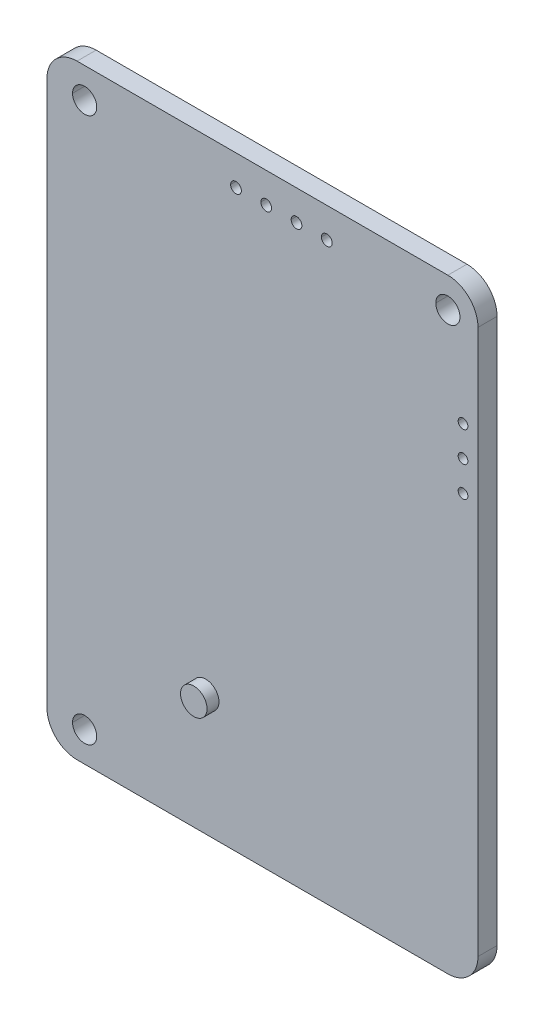
ISO-10303-21;
HEADER;
FILE_DESCRIPTION(('STEP AP214'),'2;1');
FILE_NAME('part.step','',(''),(''),'','','');
FILE_SCHEMA(('AUTOMOTIVE_DESIGN { 1 0 10303 214 1 1 1 1 }'));
ENDSEC;
DATA;
#1=APPLICATION_CONTEXT('core data for automotive mechanical design processes');
#2=APPLICATION_PROTOCOL_DEFINITION('international standard','automotive_design',2000,#1);
#3=PRODUCT_CONTEXT('',#1,'mechanical');
#4=PRODUCT('Part','Part','',(#3));
#5=PRODUCT_RELATED_PRODUCT_CATEGORY('part','',(#4));
#6=PRODUCT_DEFINITION_FORMATION('','',#4);
#7=PRODUCT_DEFINITION_CONTEXT('part definition',#1,'design');
#8=PRODUCT_DEFINITION('design','',#6,#7);
#9=PRODUCT_DEFINITION_SHAPE('','',#8);
#10=(LENGTH_UNIT() NAMED_UNIT(*) SI_UNIT(.MILLI.,.METRE.));
#11=(NAMED_UNIT(*) PLANE_ANGLE_UNIT() SI_UNIT($,.RADIAN.));
#12=(NAMED_UNIT(*) SI_UNIT($,.STERADIAN.) SOLID_ANGLE_UNIT());
#13=UNCERTAINTY_MEASURE_WITH_UNIT(LENGTH_MEASURE(1.E-05),#10,'distance_accuracy_value','');
#14=(GEOMETRIC_REPRESENTATION_CONTEXT(3) GLOBAL_UNCERTAINTY_ASSIGNED_CONTEXT((#13)) GLOBAL_UNIT_ASSIGNED_CONTEXT((#10,
#11,#12)) REPRESENTATION_CONTEXT('',''));
#15=CARTESIAN_POINT('',(0.,0.,0.));
#16=DIRECTION('',(0.,0.,1.));
#17=DIRECTION('',(1.,0.,0.));
#18=AXIS2_PLACEMENT_3D('',#15,#16,#17);
#19=CARTESIAN_POINT('',(17.46253492507,-25.4000508001,1.600028244856));
#20=DIRECTION('',(0.,0.,-1.));
#21=DIRECTION('',(0.,-1.,0.));
#22=AXIS2_PLACEMENT_3D('',#19,#20,#21);
#23=PLANE('',#22);
#24=CARTESIAN_POINT('',(12.7000254000505,-40.635081284928,1.600028244856));
#25=DIRECTION('',(0.,0.,-1.));
#26=DIRECTION('',(-1.,0.,0.));
#27=AXIS2_PLACEMENT_3D('',#24,#25,#26);
#28=CIRCLE('',#27,1.11210639390257);
#29=CARTESIAN_POINT('',(11.5879190061479,-40.635081284928,1.600028244856));
#30=VERTEX_POINT('',#29);
#31=EDGE_CURVE('E11',#30,#30,#28,.F.);
#32=ORIENTED_EDGE('',*,*,#31,.F.);
#33=EDGE_LOOP('',(#32));
#34=FACE_BOUND('',#33,.T.);
#35=CARTESIAN_POINT('',(34.290068580137,-10.16002032004,1.600028244856));
#36=DIRECTION('',(0.,0.,1.));
#37=DIRECTION('',(-1.,0.,0.));
#38=AXIS2_PLACEMENT_3D('',#35,#36,#37);
#39=CIRCLE('',#38,0.406400812802);
#40=CARTESIAN_POINT('',(33.883667767336,-10.16002032004,1.600028244856));
#41=VERTEX_POINT('',#40);
#42=CARTESIAN_POINT('',(34.696469392939,-10.16002032004,1.600028244856));
#43=VERTEX_POINT('',#42);
#44=EDGE_CURVE('E76',#41,#43,#39,.T.);
#45=ORIENTED_EDGE('',*,*,#44,.F.);
#46=CARTESIAN_POINT('',(34.290068580137,-10.16002032004,1.600028244856));
#47=DIRECTION('',(0.,0.,1.));
#48=DIRECTION('',(1.,0.,0.));
#49=AXIS2_PLACEMENT_3D('',#46,#47,#48);
#50=CIRCLE('',#49,0.406400812802);
#51=EDGE_CURVE('E443',#43,#41,#50,.T.);
#52=ORIENTED_EDGE('',*,*,#51,.F.);
#53=EDGE_LOOP('',(#45,#52));
#54=FACE_BOUND('',#53,.T.);
#55=CARTESIAN_POINT('',(34.290068580137,-12.70002540005,1.600028244856));
#56=DIRECTION('',(0.,0.,1.));
#57=DIRECTION('',(-1.,0.,0.));
#58=AXIS2_PLACEMENT_3D('',#55,#56,#57);
#59=CIRCLE('',#58,0.406400812802);
#60=CARTESIAN_POINT('',(33.883667767336,-12.70002540005,1.600028244856));
#61=VERTEX_POINT('',#60);
#62=CARTESIAN_POINT('',(34.696469392939,-12.70002540005,1.600028244856));
#63=VERTEX_POINT('',#62);
#64=EDGE_CURVE('E605',#61,#63,#59,.T.);
#65=ORIENTED_EDGE('',*,*,#64,.F.);
#66=CARTESIAN_POINT('',(34.290068580137,-12.70002540005,1.600028244856));
#67=DIRECTION('',(0.,0.,1.));
#68=DIRECTION('',(1.,0.,0.));
#69=AXIS2_PLACEMENT_3D('',#66,#67,#68);
#70=CIRCLE('',#69,0.406400812802);
#71=EDGE_CURVE('E394',#63,#61,#70,.T.);
#72=ORIENTED_EDGE('',*,*,#71,.F.);
#73=EDGE_LOOP('',(#65,#72));
#74=FACE_BOUND('',#73,.T.);
#75=CARTESIAN_POINT('',(34.290068580137,-15.24003048006,1.600028244856));
#76=DIRECTION('',(0.,0.,1.));
#77=DIRECTION('',(-1.,0.,0.));
#78=AXIS2_PLACEMENT_3D('',#75,#76,#77);
#79=CIRCLE('',#78,0.406400812802);
#80=CARTESIAN_POINT('',(33.883667767336,-15.24003048006,1.600028244856));
#81=VERTEX_POINT('',#80);
#82=CARTESIAN_POINT('',(34.696469392939,-15.24003048006,1.600028244856));
#83=VERTEX_POINT('',#82);
#84=EDGE_CURVE('E593',#81,#83,#79,.T.);
#85=ORIENTED_EDGE('',*,*,#84,.F.);
#86=CARTESIAN_POINT('',(34.290068580137,-15.24003048006,1.600028244856));
#87=DIRECTION('',(0.,0.,1.));
#88=DIRECTION('',(1.,0.,0.));
#89=AXIS2_PLACEMENT_3D('',#86,#87,#88);
#90=CIRCLE('',#89,0.406400812802);
#91=EDGE_CURVE('E476',#83,#81,#90,.T.);
#92=ORIENTED_EDGE('',*,*,#91,.F.);
#93=EDGE_LOOP('',(#85,#92));
#94=FACE_BOUND('',#93,.T.);
#95=CARTESIAN_POINT('',(33.020066040132,-2.54000508001,1.600028244856));
#96=DIRECTION('',(0.,0.,1.));
#97=DIRECTION('',(-1.,0.,0.));
#98=AXIS2_PLACEMENT_3D('',#95,#96,#97);
#99=CIRCLE('',#98,1.016002032004);
#100=CARTESIAN_POINT('',(32.004064008128,-2.54000508001,1.600028244856));
#101=VERTEX_POINT('',#100);
#102=CARTESIAN_POINT('',(34.036068072136,-2.54000508001,1.600028244856));
#103=VERTEX_POINT('',#102);
#104=EDGE_CURVE('E378',#101,#103,#99,.T.);
#105=ORIENTED_EDGE('',*,*,#104,.F.);
#106=CARTESIAN_POINT('',(33.020066040132,-2.54000508001,1.600028244856));
#107=DIRECTION('',(0.,0.,1.));
#108=DIRECTION('',(1.,0.,0.));
#109=AXIS2_PLACEMENT_3D('',#106,#107,#108);
#110=CIRCLE('',#109,1.016002032004);
#111=EDGE_CURVE('E482',#103,#101,#110,.T.);
#112=ORIENTED_EDGE('',*,*,#111,.F.);
#113=EDGE_LOOP('',(#105,#112));
#114=FACE_BOUND('',#113,.T.);
#115=CARTESIAN_POINT('',(22.860045720091,-2.54000508001,1.600028244856));
#116=DIRECTION('',(0.,0.,1.));
#117=DIRECTION('',(-1.,0.,0.));
#118=AXIS2_PLACEMENT_3D('',#115,#116,#117);
#119=CIRCLE('',#118,0.450012700025);
#120=CARTESIAN_POINT('',(22.410033020066,-2.54000508001,1.600028244856));
#121=VERTEX_POINT('',#120);
#122=CARTESIAN_POINT('',(23.310058420117,-2.54000508001,1.600028244856));
#123=VERTEX_POINT('',#122);
#124=EDGE_CURVE('E570',#121,#123,#119,.T.);
#125=ORIENTED_EDGE('',*,*,#124,.F.);
#126=CARTESIAN_POINT('',(22.860045720091,-2.54000508001,1.600028244856));
#127=DIRECTION('',(0.,0.,1.));
#128=DIRECTION('',(1.,0.,0.));
#129=AXIS2_PLACEMENT_3D('',#126,#127,#128);
#130=CIRCLE('',#129,0.450012700025);
#131=EDGE_CURVE('E558',#123,#121,#130,.T.);
#132=ORIENTED_EDGE('',*,*,#131,.F.);
#133=EDGE_LOOP('',(#125,#132));
#134=FACE_BOUND('',#133,.T.);
#135=CARTESIAN_POINT('',(20.320040640081,-2.54000508001,1.600028244856));
#136=DIRECTION('',(0.,0.,1.));
#137=DIRECTION('',(-1.,0.,0.));
#138=AXIS2_PLACEMENT_3D('',#135,#136,#137);
#139=CIRCLE('',#138,0.450012700025);
#140=CARTESIAN_POINT('',(19.870027940056,-2.54000508001,1.600028244856));
#141=VERTEX_POINT('',#140);
#142=CARTESIAN_POINT('',(20.770053340107,-2.54000508001,1.600028244856));
#143=VERTEX_POINT('',#142);
#144=EDGE_CURVE('E406',#141,#143,#139,.T.);
#145=ORIENTED_EDGE('',*,*,#144,.F.);
#146=CARTESIAN_POINT('',(20.320040640081,-2.54000508001,1.600028244856));
#147=DIRECTION('',(0.,0.,1.));
#148=DIRECTION('',(1.,0.,0.));
#149=AXIS2_PLACEMENT_3D('',#146,#147,#148);
#150=CIRCLE('',#149,0.450012700025);
#151=EDGE_CURVE('E432',#143,#141,#150,.T.);
#152=ORIENTED_EDGE('',*,*,#151,.F.);
#153=EDGE_LOOP('',(#145,#152));
#154=FACE_BOUND('',#153,.T.);
#155=CARTESIAN_POINT('',(17.780035560071,-2.54000508001,1.600028244856));
#156=DIRECTION('',(0.,0.,1.));
#157=DIRECTION('',(-1.,0.,0.));
#158=AXIS2_PLACEMENT_3D('',#155,#156,#157);
#159=CIRCLE('',#158,0.450012700025);
#160=CARTESIAN_POINT('',(17.330022860046,-2.54000508001,1.600028244856));
#161=VERTEX_POINT('',#160);
#162=CARTESIAN_POINT('',(18.230048260097,-2.54000508001,1.600028244856));
#163=VERTEX_POINT('',#162);
#164=EDGE_CURVE('E507',#161,#163,#159,.T.);
#165=ORIENTED_EDGE('',*,*,#164,.F.);
#166=CARTESIAN_POINT('',(17.780035560071,-2.54000508001,1.600028244856));
#167=DIRECTION('',(0.,0.,1.));
#168=DIRECTION('',(1.,0.,0.));
#169=AXIS2_PLACEMENT_3D('',#166,#167,#168);
#170=CIRCLE('',#169,0.450012700025);
#171=EDGE_CURVE('E411',#163,#161,#170,.T.);
#172=ORIENTED_EDGE('',*,*,#171,.F.);
#173=EDGE_LOOP('',(#165,#172));
#174=FACE_BOUND('',#173,.T.);
#175=CARTESIAN_POINT('',(15.240030480061,-2.54000508001,1.600028244856));
#176=DIRECTION('',(0.,0.,1.));
#177=DIRECTION('',(-1.,0.,0.));
#178=AXIS2_PLACEMENT_3D('',#175,#176,#177);
#179=CIRCLE('',#178,0.450012700025);
#180=CARTESIAN_POINT('',(14.790017780036,-2.54000508001,1.600028244856));
#181=VERTEX_POINT('',#180);
#182=CARTESIAN_POINT('',(15.690043180086,-2.54000508001,1.600028244856));
#183=VERTEX_POINT('',#182);
#184=EDGE_CURVE('E337',#181,#183,#179,.T.);
#185=ORIENTED_EDGE('',*,*,#184,.F.);
#186=CARTESIAN_POINT('',(15.240030480061,-2.54000508001,1.600028244856));
#187=DIRECTION('',(0.,0.,1.));
#188=DIRECTION('',(1.,0.,0.));
#189=AXIS2_PLACEMENT_3D('',#186,#187,#188);
#190=CIRCLE('',#189,0.450012700025);
#191=EDGE_CURVE('E514',#183,#181,#190,.T.);
#192=ORIENTED_EDGE('',*,*,#191,.F.);
#193=EDGE_LOOP('',(#185,#192));
#194=FACE_BOUND('',#193,.T.);
#195=CARTESIAN_POINT('',(2.54000508001,-2.54000508001,1.600028244856));
#196=DIRECTION('',(0.,0.,1.));
#197=DIRECTION('',(-1.,0.,0.));
#198=AXIS2_PLACEMENT_3D('',#195,#196,#197);
#199=CIRCLE('',#198,1.016002032004);
#200=CARTESIAN_POINT('',(1.524003048006,-2.54000508001,1.600028244856));
#201=VERTEX_POINT('',#200);
#202=CARTESIAN_POINT('',(3.556007112014,-2.54000508001,1.600028244856));
#203=VERTEX_POINT('',#202);
#204=EDGE_CURVE('E501',#201,#203,#199,.T.);
#205=ORIENTED_EDGE('',*,*,#204,.F.);
#206=CARTESIAN_POINT('',(2.54000508001,-2.54000508001,1.600028244856));
#207=DIRECTION('',(0.,0.,1.));
#208=DIRECTION('',(1.,0.,0.));
#209=AXIS2_PLACEMENT_3D('',#206,#207,#208);
#210=CIRCLE('',#209,1.016002032004);
#211=EDGE_CURVE('E475',#203,#201,#210,.T.);
#212=ORIENTED_EDGE('',*,*,#211,.F.);
#213=EDGE_LOOP('',(#205,#212));
#214=FACE_BOUND('',#213,.T.);
#215=CARTESIAN_POINT('',(2.54000508001,-48.26009652019,1.600028244856));
#216=DIRECTION('',(0.,0.,1.));
#217=DIRECTION('',(-1.,0.,0.));
#218=AXIS2_PLACEMENT_3D('',#215,#216,#217);
#219=CIRCLE('',#218,1.016002032004);
#220=CARTESIAN_POINT('',(1.524003048006,-48.26009652019,1.600028244856));
#221=VERTEX_POINT('',#220);
#222=CARTESIAN_POINT('',(3.556007112014,-48.26009652019,1.600028244856));
#223=VERTEX_POINT('',#222);
#224=EDGE_CURVE('E461',#221,#223,#219,.T.);
#225=ORIENTED_EDGE('',*,*,#224,.F.);
#226=CARTESIAN_POINT('',(2.54000508001,-48.26009652019,1.600028244856));
#227=DIRECTION('',(0.,0.,1.));
#228=DIRECTION('',(1.,0.,0.));
#229=AXIS2_PLACEMENT_3D('',#226,#227,#228);
#230=CIRCLE('',#229,1.016002032004);
#231=EDGE_CURVE('E449',#223,#221,#230,.T.);
#232=ORIENTED_EDGE('',*,*,#231,.F.);
#233=EDGE_LOOP('',(#225,#232));
#234=FACE_BOUND('',#233,.T.);
#235=CARTESIAN_POINT('',(1.905003810008,-2.54000508001,1.600028244856));
#236=DIRECTION('',(0.,0.,-1.));
#237=DIRECTION('',(-1.,0.,0.));
#238=AXIS2_PLACEMENT_3D('',#235,#236,#237);
#239=CIRCLE('',#238,2.52730505461);
#240=CARTESIAN_POINT('',(-0.622301244602,-2.54000508001,1.600028244856));
#241=VERTEX_POINT('',#240);
#242=CARTESIAN_POINT('',(1.905003810008,-0.01270002540005,1.600028244856));
#243=VERTEX_POINT('',#242);
#244=EDGE_CURVE('E308',#241,#243,#239,.T.);
#245=ORIENTED_EDGE('',*,*,#244,.F.);
#246=DIRECTION('',(0.,1.,0.));
#247=VECTOR('',#246,1.);
#248=CARTESIAN_POINT('',(-0.622301244602,-48.26009652019,1.600028244856));
#249=LINE('',#248,#247);
#250=CARTESIAN_POINT('',(-0.622301244602,-48.26009652019,1.600028244856));
#251=VERTEX_POINT('',#250);
#252=EDGE_CURVE('E426',#251,#241,#249,.T.);
#253=ORIENTED_EDGE('',*,*,#252,.F.);
#254=CARTESIAN_POINT('',(1.905003810008,-48.26009652019,1.600028244856));
#255=DIRECTION('',(0.,0.,-1.));
#256=DIRECTION('',(0.,-1.,0.));
#257=AXIS2_PLACEMENT_3D('',#254,#255,#256);
#258=CIRCLE('',#257,2.52730505461);
#259=CARTESIAN_POINT('',(1.905003810008,-50.7874015748,1.600028244856));
#260=VERTEX_POINT('',#259);
#261=EDGE_CURVE('E415',#260,#251,#258,.T.);
#262=ORIENTED_EDGE('',*,*,#261,.F.);
#263=DIRECTION('',(-1.,0.,0.));
#264=VECTOR('',#263,1.);
#265=CARTESIAN_POINT('',(33.020066040132,-50.7874015748,1.600028244856));
#266=LINE('',#265,#264);
#267=CARTESIAN_POINT('',(33.020066040132,-50.7874015748,1.600028244856));
#268=VERTEX_POINT('',#267);
#269=EDGE_CURVE('E360',#268,#260,#266,.T.);
#270=ORIENTED_EDGE('',*,*,#269,.F.);
#271=CARTESIAN_POINT('',(33.020066040132,-48.26009652019,1.600028244856));
#272=DIRECTION('',(0.,0.,-1.));
#273=DIRECTION('',(1.,0.,0.));
#274=AXIS2_PLACEMENT_3D('',#271,#272,#273);
#275=CIRCLE('',#274,2.52730505461);
#276=CARTESIAN_POINT('',(35.547371094742,-48.26009652019,1.600028244856));
#277=VERTEX_POINT('',#276);
#278=EDGE_CURVE('E365',#277,#268,#275,.T.);
#279=ORIENTED_EDGE('',*,*,#278,.F.);
#280=DIRECTION('',(0.,-1.,0.));
#281=VECTOR('',#280,1.);
#282=CARTESIAN_POINT('',(35.547371094742,-2.54000508001,1.600028244856));
#283=LINE('',#282,#281);
#284=CARTESIAN_POINT('',(35.547371094742,-2.54000508001,1.600028244856));
#285=VERTEX_POINT('',#284);
#286=EDGE_CURVE('E373',#285,#277,#283,.T.);
#287=ORIENTED_EDGE('',*,*,#286,.F.);
#288=CARTESIAN_POINT('',(33.020066040132,-2.54000508001,1.600028244856));
#289=DIRECTION('',(0.,0.,-1.));
#290=DIRECTION('',(0.,1.,0.));
#291=AXIS2_PLACEMENT_3D('',#288,#289,#290);
#292=CIRCLE('',#291,2.52730505461);
#293=CARTESIAN_POINT('',(33.020066040132,-0.01270002540005,1.600028244856));
#294=VERTEX_POINT('',#293);
#295=EDGE_CURVE('E318',#294,#285,#292,.T.);
#296=ORIENTED_EDGE('',*,*,#295,.F.);
#297=DIRECTION('',(1.,0.,0.));
#298=VECTOR('',#297,1.);
#299=CARTESIAN_POINT('',(1.905003810008,-0.01270002540005,1.600028244856));
#300=LINE('',#299,#298);
#301=EDGE_CURVE('E323',#243,#294,#300,.T.);
#302=ORIENTED_EDGE('',*,*,#301,.F.);
#303=EDGE_LOOP('',(#245,#253,#262,#270,#279,#287,#296,#302));
#304=FACE_BOUND('',#303,.T.);
#305=ADVANCED_FACE('F49',(#34,#54,#74,#94,#114,#134,#154,#174,#194,#214,#234,#304),#23,.F.);
#306=CARTESIAN_POINT('',(17.46253492507,-25.4000508001,0.));
#307=DIRECTION('',(0.,0.,-1.));
#308=DIRECTION('',(0.,-1.,0.));
#309=AXIS2_PLACEMENT_3D('',#306,#307,#308);
#310=PLANE('',#309);
#311=CARTESIAN_POINT('',(34.290068580137,-10.16002032004,0.));
#312=DIRECTION('',(0.,0.,1.));
#313=DIRECTION('',(1.,0.,0.));
#314=AXIS2_PLACEMENT_3D('',#311,#312,#313);
#315=CIRCLE('',#314,0.406400812802);
#316=CARTESIAN_POINT('',(34.696469392939,-10.16002032004,0.));
#317=VERTEX_POINT('',#316);
#318=CARTESIAN_POINT('',(33.883667767336,-10.16002032004,0.));
#319=VERTEX_POINT('',#318);
#320=EDGE_CURVE('E530',#317,#319,#315,.T.);
#321=ORIENTED_EDGE('',*,*,#320,.T.);
#322=CARTESIAN_POINT('',(34.290068580137,-10.16002032004,0.));
#323=DIRECTION('',(0.,0.,1.));
#324=DIRECTION('',(-1.,0.,0.));
#325=AXIS2_PLACEMENT_3D('',#322,#323,#324);
#326=CIRCLE('',#325,0.406400812802);
#327=EDGE_CURVE('E57',#319,#317,#326,.T.);
#328=ORIENTED_EDGE('',*,*,#327,.T.);
#329=EDGE_LOOP('',(#321,#328));
#330=FACE_BOUND('',#329,.T.);
#331=CARTESIAN_POINT('',(34.290068580137,-12.70002540005,0.));
#332=DIRECTION('',(0.,0.,1.));
#333=DIRECTION('',(1.,0.,0.));
#334=AXIS2_PLACEMENT_3D('',#331,#332,#333);
#335=CIRCLE('',#334,0.406400812802);
#336=CARTESIAN_POINT('',(34.696469392939,-12.70002540005,0.));
#337=VERTEX_POINT('',#336);
#338=CARTESIAN_POINT('',(33.883667767336,-12.70002540005,0.));
#339=VERTEX_POINT('',#338);
#340=EDGE_CURVE('E393',#337,#339,#335,.T.);
#341=ORIENTED_EDGE('',*,*,#340,.T.);
#342=CARTESIAN_POINT('',(34.290068580137,-12.70002540005,0.));
#343=DIRECTION('',(0.,0.,1.));
#344=DIRECTION('',(-1.,0.,0.));
#345=AXIS2_PLACEMENT_3D('',#342,#343,#344);
#346=CIRCLE('',#345,0.406400812802);
#347=EDGE_CURVE('E444',#339,#337,#346,.T.);
#348=ORIENTED_EDGE('',*,*,#347,.T.);
#349=EDGE_LOOP('',(#341,#348));
#350=FACE_BOUND('',#349,.T.);
#351=CARTESIAN_POINT('',(34.290068580137,-15.24003048006,0.));
#352=DIRECTION('',(0.,0.,1.));
#353=DIRECTION('',(1.,0.,0.));
#354=AXIS2_PLACEMENT_3D('',#351,#352,#353);
#355=CIRCLE('',#354,0.406400812802);
#356=CARTESIAN_POINT('',(34.696469392939,-15.24003048006,0.));
#357=VERTEX_POINT('',#356);
#358=CARTESIAN_POINT('',(33.883667767336,-15.24003048006,0.));
#359=VERTEX_POINT('',#358);
#360=EDGE_CURVE('E589',#357,#359,#355,.T.);
#361=ORIENTED_EDGE('',*,*,#360,.T.);
#362=CARTESIAN_POINT('',(34.290068580137,-15.24003048006,0.));
#363=DIRECTION('',(0.,0.,1.));
#364=DIRECTION('',(-1.,0.,0.));
#365=AXIS2_PLACEMENT_3D('',#362,#363,#364);
#366=CIRCLE('',#365,0.406400812802);
#367=EDGE_CURVE('E596',#359,#357,#366,.T.);
#368=ORIENTED_EDGE('',*,*,#367,.T.);
#369=EDGE_LOOP('',(#361,#368));
#370=FACE_BOUND('',#369,.T.);
#371=CARTESIAN_POINT('',(33.020066040132,-2.54000508001,0.));
#372=DIRECTION('',(0.,0.,1.));
#373=DIRECTION('',(1.,0.,0.));
#374=AXIS2_PLACEMENT_3D('',#371,#372,#373);
#375=CIRCLE('',#374,1.016002032004);
#376=CARTESIAN_POINT('',(34.036068072136,-2.54000508001,0.));
#377=VERTEX_POINT('',#376);
#378=CARTESIAN_POINT('',(32.004064008128,-2.54000508001,0.));
#379=VERTEX_POINT('',#378);
#380=EDGE_CURVE('E382',#377,#379,#375,.T.);
#381=ORIENTED_EDGE('',*,*,#380,.T.);
#382=CARTESIAN_POINT('',(33.020066040132,-2.54000508001,0.));
#383=DIRECTION('',(0.,0.,1.));
#384=DIRECTION('',(-1.,0.,0.));
#385=AXIS2_PLACEMENT_3D('',#382,#383,#384);
#386=CIRCLE('',#385,1.016002032004);
#387=EDGE_CURVE('E381',#379,#377,#386,.T.);
#388=ORIENTED_EDGE('',*,*,#387,.T.);
#389=EDGE_LOOP('',(#381,#388));
#390=FACE_BOUND('',#389,.T.);
#391=CARTESIAN_POINT('',(22.860045720091,-2.54000508001,0.));
#392=DIRECTION('',(0.,0.,1.));
#393=DIRECTION('',(1.,0.,0.));
#394=AXIS2_PLACEMENT_3D('',#391,#392,#393);
#395=CIRCLE('',#394,0.450012700025);
#396=CARTESIAN_POINT('',(23.310058420117,-2.54000508001,0.));
#397=VERTEX_POINT('',#396);
#398=CARTESIAN_POINT('',(22.410033020066,-2.54000508001,0.));
#399=VERTEX_POINT('',#398);
#400=EDGE_CURVE('E566',#397,#399,#395,.T.);
#401=ORIENTED_EDGE('',*,*,#400,.T.);
#402=CARTESIAN_POINT('',(22.860045720091,-2.54000508001,0.));
#403=DIRECTION('',(0.,0.,1.));
#404=DIRECTION('',(-1.,0.,0.));
#405=AXIS2_PLACEMENT_3D('',#402,#403,#404);
#406=CIRCLE('',#405,0.450012700025);
#407=EDGE_CURVE('E554',#399,#397,#406,.T.);
#408=ORIENTED_EDGE('',*,*,#407,.T.);
#409=EDGE_LOOP('',(#401,#408));
#410=FACE_BOUND('',#409,.T.);
#411=CARTESIAN_POINT('',(20.320040640081,-2.54000508001,0.));
#412=DIRECTION('',(0.,0.,1.));
#413=DIRECTION('',(1.,0.,0.));
#414=AXIS2_PLACEMENT_3D('',#411,#412,#413);
#415=CIRCLE('',#414,0.450012700025);
#416=CARTESIAN_POINT('',(20.770053340107,-2.54000508001,0.));
#417=VERTEX_POINT('',#416);
#418=CARTESIAN_POINT('',(19.870027940056,-2.54000508001,0.));
#419=VERTEX_POINT('',#418);
#420=EDGE_CURVE('E431',#417,#419,#415,.T.);
#421=ORIENTED_EDGE('',*,*,#420,.T.);
#422=CARTESIAN_POINT('',(20.320040640081,-2.54000508001,0.));
#423=DIRECTION('',(0.,0.,1.));
#424=DIRECTION('',(-1.,0.,0.));
#425=AXIS2_PLACEMENT_3D('',#422,#423,#424);
#426=CIRCLE('',#425,0.450012700025);
#427=EDGE_CURVE('E402',#419,#417,#426,.T.);
#428=ORIENTED_EDGE('',*,*,#427,.T.);
#429=EDGE_LOOP('',(#421,#428));
#430=FACE_BOUND('',#429,.T.);
#431=CARTESIAN_POINT('',(17.780035560071,-2.54000508001,0.));
#432=DIRECTION('',(0.,0.,1.));
#433=DIRECTION('',(1.,0.,0.));
#434=AXIS2_PLACEMENT_3D('',#431,#432,#433);
#435=CIRCLE('',#434,0.450012700025);
#436=CARTESIAN_POINT('',(18.230048260097,-2.54000508001,0.));
#437=VERTEX_POINT('',#436);
#438=CARTESIAN_POINT('',(17.330022860046,-2.54000508001,0.));
#439=VERTEX_POINT('',#438);
#440=EDGE_CURVE('E541',#437,#439,#435,.T.);
#441=ORIENTED_EDGE('',*,*,#440,.T.);
#442=CARTESIAN_POINT('',(17.780035560071,-2.54000508001,0.));
#443=DIRECTION('',(0.,0.,1.));
#444=DIRECTION('',(-1.,0.,0.));
#445=AXIS2_PLACEMENT_3D('',#442,#443,#444);
#446=CIRCLE('',#445,0.450012700025);
#447=EDGE_CURVE('E465',#439,#437,#446,.T.);
#448=ORIENTED_EDGE('',*,*,#447,.T.);
#449=EDGE_LOOP('',(#441,#448));
#450=FACE_BOUND('',#449,.T.);
#451=CARTESIAN_POINT('',(15.240030480061,-2.54000508001,0.));
#452=DIRECTION('',(0.,0.,1.));
#453=DIRECTION('',(1.,0.,0.));
#454=AXIS2_PLACEMENT_3D('',#451,#452,#453);
#455=CIRCLE('',#454,0.450012700025);
#456=CARTESIAN_POINT('',(15.690043180086,-2.54000508001,0.));
#457=VERTEX_POINT('',#456);
#458=CARTESIAN_POINT('',(14.790017780036,-2.54000508001,0.));
#459=VERTEX_POINT('',#458);
#460=EDGE_CURVE('E341',#457,#459,#455,.T.);
#461=ORIENTED_EDGE('',*,*,#460,.T.);
#462=CARTESIAN_POINT('',(15.240030480061,-2.54000508001,0.));
#463=DIRECTION('',(0.,0.,1.));
#464=DIRECTION('',(-1.,0.,0.));
#465=AXIS2_PLACEMENT_3D('',#462,#463,#464);
#466=CIRCLE('',#465,0.450012700025);
#467=EDGE_CURVE('E340',#459,#457,#466,.T.);
#468=ORIENTED_EDGE('',*,*,#467,.T.);
#469=EDGE_LOOP('',(#461,#468));
#470=FACE_BOUND('',#469,.T.);
#471=CARTESIAN_POINT('',(2.54000508001,-2.54000508001,0.));
#472=DIRECTION('',(0.,0.,1.));
#473=DIRECTION('',(1.,0.,0.));
#474=AXIS2_PLACEMENT_3D('',#471,#472,#473);
#475=CIRCLE('',#474,1.016002032004);
#476=CARTESIAN_POINT('',(3.556007112014,-2.54000508001,0.));
#477=VERTEX_POINT('',#476);
#478=CARTESIAN_POINT('',(1.524003048006,-2.54000508001,0.));
#479=VERTEX_POINT('',#478);
#480=EDGE_CURVE('E495',#477,#479,#475,.T.);
#481=ORIENTED_EDGE('',*,*,#480,.T.);
#482=CARTESIAN_POINT('',(2.54000508001,-2.54000508001,0.));
#483=DIRECTION('',(0.,0.,1.));
#484=DIRECTION('',(-1.,0.,0.));
#485=AXIS2_PLACEMENT_3D('',#482,#483,#484);
#486=CIRCLE('',#485,1.016002032004);
#487=EDGE_CURVE('E504',#479,#477,#486,.T.);
#488=ORIENTED_EDGE('',*,*,#487,.T.);
#489=EDGE_LOOP('',(#481,#488));
#490=FACE_BOUND('',#489,.T.);
#491=CARTESIAN_POINT('',(2.54000508001,-48.26009652019,0.));
#492=DIRECTION('',(0.,0.,1.));
#493=DIRECTION('',(1.,0.,0.));
#494=AXIS2_PLACEMENT_3D('',#491,#492,#493);
#495=CIRCLE('',#494,1.016002032004);
#496=CARTESIAN_POINT('',(3.556007112014,-48.26009652019,0.));
#497=VERTEX_POINT('',#496);
#498=CARTESIAN_POINT('',(1.524003048006,-48.26009652019,0.));
#499=VERTEX_POINT('',#498);
#500=EDGE_CURVE('E457',#497,#499,#495,.T.);
#501=ORIENTED_EDGE('',*,*,#500,.T.);
#502=CARTESIAN_POINT('',(2.54000508001,-48.26009652019,0.));
#503=DIRECTION('',(0.,0.,1.));
#504=DIRECTION('',(-1.,0.,0.));
#505=AXIS2_PLACEMENT_3D('',#502,#503,#504);
#506=CIRCLE('',#505,1.016002032004);
#507=EDGE_CURVE('E468',#499,#497,#506,.T.);
#508=ORIENTED_EDGE('',*,*,#507,.T.);
#509=EDGE_LOOP('',(#501,#508));
#510=FACE_BOUND('',#509,.T.);
#511=DIRECTION('',(1.,0.,0.));
#512=VECTOR('',#511,1.);
#513=CARTESIAN_POINT('',(1.905003810008,-0.01270002540005,0.));
#514=LINE('',#513,#512);
#515=CARTESIAN_POINT('',(1.905003810008,-0.01270002540005,0.));
#516=VERTEX_POINT('',#515);
#517=CARTESIAN_POINT('',(33.020066040132,-0.01270002540005,0.));
#518=VERTEX_POINT('',#517);
#519=EDGE_CURVE('E298',#516,#518,#514,.T.);
#520=ORIENTED_EDGE('',*,*,#519,.T.);
#521=CARTESIAN_POINT('',(33.020066040132,-2.54000508001,0.));
#522=DIRECTION('',(0.,0.,-1.));
#523=DIRECTION('',(0.,1.,0.));
#524=AXIS2_PLACEMENT_3D('',#521,#522,#523);
#525=CIRCLE('',#524,2.52730505461);
#526=CARTESIAN_POINT('',(35.547371094742,-2.54000508001,0.));
#527=VERTEX_POINT('',#526);
#528=EDGE_CURVE('E350',#518,#527,#525,.T.);
#529=ORIENTED_EDGE('',*,*,#528,.T.);
#530=DIRECTION('',(0.,-1.,0.));
#531=VECTOR('',#530,1.);
#532=CARTESIAN_POINT('',(35.547371094742,-2.54000508001,0.));
#533=LINE('',#532,#531);
#534=CARTESIAN_POINT('',(35.547371094742,-48.26009652019,0.));
#535=VERTEX_POINT('',#534);
#536=EDGE_CURVE('E370',#527,#535,#533,.T.);
#537=ORIENTED_EDGE('',*,*,#536,.T.);
#538=CARTESIAN_POINT('',(33.020066040132,-48.26009652019,0.));
#539=DIRECTION('',(0.,0.,-1.));
#540=DIRECTION('',(1.,0.,0.));
#541=AXIS2_PLACEMENT_3D('',#538,#539,#540);
#542=CIRCLE('',#541,2.52730505461);
#543=CARTESIAN_POINT('',(33.020066040132,-50.7874015748,0.));
#544=VERTEX_POINT('',#543);
#545=EDGE_CURVE('E364',#535,#544,#542,.T.);
#546=ORIENTED_EDGE('',*,*,#545,.T.);
#547=DIRECTION('',(-1.,0.,0.));
#548=VECTOR('',#547,1.);
#549=CARTESIAN_POINT('',(33.020066040132,-50.7874015748,0.));
#550=LINE('',#549,#548);
#551=CARTESIAN_POINT('',(1.905003810008,-50.7874015748,0.));
#552=VERTEX_POINT('',#551);
#553=EDGE_CURVE('E359',#544,#552,#550,.T.);
#554=ORIENTED_EDGE('',*,*,#553,.T.);
#555=CARTESIAN_POINT('',(1.905003810008,-48.26009652019,0.));
#556=DIRECTION('',(0.,0.,-1.));
#557=DIRECTION('',(0.,-1.,0.));
#558=AXIS2_PLACEMENT_3D('',#555,#556,#557);
#559=CIRCLE('',#558,2.52730505461);
#560=CARTESIAN_POINT('',(-0.622301244602,-48.26009652019,0.));
#561=VERTEX_POINT('',#560);
#562=EDGE_CURVE('E423',#552,#561,#559,.T.);
#563=ORIENTED_EDGE('',*,*,#562,.T.);
#564=DIRECTION('',(0.,1.,0.));
#565=VECTOR('',#564,1.);
#566=CARTESIAN_POINT('',(-0.622301244602,-48.26009652019,0.));
#567=LINE('',#566,#565);
#568=CARTESIAN_POINT('',(-0.622301244602,-2.54000508001,0.));
#569=VERTEX_POINT('',#568);
#570=EDGE_CURVE('E301',#561,#569,#567,.T.);
#571=ORIENTED_EDGE('',*,*,#570,.T.);
#572=CARTESIAN_POINT('',(1.905003810008,-2.54000508001,0.));
#573=DIRECTION('',(0.,0.,-1.));
#574=DIRECTION('',(-1.,0.,0.));
#575=AXIS2_PLACEMENT_3D('',#572,#573,#574);
#576=CIRCLE('',#575,2.52730505461);
#577=EDGE_CURVE('E294',#569,#516,#576,.T.);
#578=ORIENTED_EDGE('',*,*,#577,.T.);
#579=EDGE_LOOP('',(#520,#529,#537,#546,#554,#563,#571,#578));
#580=FACE_BOUND('',#579,.T.);
#581=ADVANCED_FACE('F296',(#330,#350,#370,#390,#410,#430,#450,#470,#490,#510,#580),#310,.T.);
#582=CARTESIAN_POINT('',(34.290068580137,-10.16002032004,0.));
#583=DIRECTION('',(0.,0.,-1.));
#584=DIRECTION('',(-1.,0.,0.));
#585=AXIS2_PLACEMENT_3D('',#582,#583,#584);
#586=CYLINDRICAL_SURFACE('',#585,0.406400812802);
#587=DIRECTION('',(0.,0.,1.));
#588=VECTOR('',#587,1.);
#589=CARTESIAN_POINT('',(33.883667767336,-10.16002032004,0.));
#590=LINE('',#589,#588);
#591=EDGE_CURVE('E533',#319,#41,#590,.T.);
#592=ORIENTED_EDGE('',*,*,#591,.T.);
#593=ORIENTED_EDGE('',*,*,#44,.T.);
#594=DIRECTION('',(0.,0.,1.));
#595=VECTOR('',#594,1.);
#596=CARTESIAN_POINT('',(34.696469392939,-10.16002032004,0.));
#597=LINE('',#596,#595);
#598=EDGE_CURVE('E440',#317,#43,#597,.T.);
#599=ORIENTED_EDGE('',*,*,#598,.F.);
#600=ORIENTED_EDGE('',*,*,#327,.F.);
#601=EDGE_LOOP('',(#592,#593,#599,#600));
#602=FACE_BOUND('',#601,.T.);
#603=ADVANCED_FACE('F615',(#602),#586,.F.);
#604=CARTESIAN_POINT('',(34.290068580137,-10.16002032004,0.));
#605=DIRECTION('',(0.,0.,-1.));
#606=DIRECTION('',(1.,0.,0.));
#607=AXIS2_PLACEMENT_3D('',#604,#605,#606);
#608=CYLINDRICAL_SURFACE('',#607,0.406400812802);
#609=ORIENTED_EDGE('',*,*,#598,.T.);
#610=ORIENTED_EDGE('',*,*,#51,.T.);
#611=ORIENTED_EDGE('',*,*,#591,.F.);
#612=ORIENTED_EDGE('',*,*,#320,.F.);
#613=EDGE_LOOP('',(#609,#610,#611,#612));
#614=FACE_BOUND('',#613,.T.);
#615=ADVANCED_FACE('F51',(#614),#608,.F.);
#616=CARTESIAN_POINT('',(34.290068580137,-12.70002540005,0.));
#617=DIRECTION('',(0.,0.,-1.));
#618=DIRECTION('',(-1.,0.,0.));
#619=AXIS2_PLACEMENT_3D('',#616,#617,#618);
#620=CYLINDRICAL_SURFACE('',#619,0.406400812802);
#621=DIRECTION('',(0.,0.,1.));
#622=VECTOR('',#621,1.);
#623=CARTESIAN_POINT('',(33.883667767336,-12.70002540005,0.));
#624=LINE('',#623,#622);
#625=EDGE_CURVE('E389',#339,#61,#624,.T.);
#626=ORIENTED_EDGE('',*,*,#625,.T.);
#627=ORIENTED_EDGE('',*,*,#64,.T.);
#628=DIRECTION('',(0.,0.,1.));
#629=VECTOR('',#628,1.);
#630=CARTESIAN_POINT('',(34.696469392939,-12.70002540005,0.));
#631=LINE('',#630,#629);
#632=EDGE_CURVE('E401',#337,#63,#631,.T.);
#633=ORIENTED_EDGE('',*,*,#632,.F.);
#634=ORIENTED_EDGE('',*,*,#347,.F.);
#635=EDGE_LOOP('',(#626,#627,#633,#634));
#636=FACE_BOUND('',#635,.T.);
#637=ADVANCED_FACE('F1178',(#636),#620,.F.);
#638=CARTESIAN_POINT('',(34.290068580137,-12.70002540005,0.));
#639=DIRECTION('',(0.,0.,-1.));
#640=DIRECTION('',(1.,0.,0.));
#641=AXIS2_PLACEMENT_3D('',#638,#639,#640);
#642=CYLINDRICAL_SURFACE('',#641,0.406400812802);
#643=ORIENTED_EDGE('',*,*,#632,.T.);
#644=ORIENTED_EDGE('',*,*,#71,.T.);
#645=ORIENTED_EDGE('',*,*,#625,.F.);
#646=ORIENTED_EDGE('',*,*,#340,.F.);
#647=EDGE_LOOP('',(#643,#644,#645,#646));
#648=FACE_BOUND('',#647,.T.);
#649=ADVANCED_FACE('F1167',(#648),#642,.F.);
#650=CARTESIAN_POINT('',(34.290068580137,-15.24003048006,0.));
#651=DIRECTION('',(0.,0.,-1.));
#652=DIRECTION('',(-1.,0.,0.));
#653=AXIS2_PLACEMENT_3D('',#650,#651,#652);
#654=CYLINDRICAL_SURFACE('',#653,0.406400812802);
#655=DIRECTION('',(0.,0.,1.));
#656=VECTOR('',#655,1.);
#657=CARTESIAN_POINT('',(33.883667767336,-15.24003048006,0.));
#658=LINE('',#657,#656);
#659=EDGE_CURVE('E480',#359,#81,#658,.T.);
#660=ORIENTED_EDGE('',*,*,#659,.T.);
#661=ORIENTED_EDGE('',*,*,#84,.T.);
#662=DIRECTION('',(0.,0.,1.));
#663=VECTOR('',#662,1.);
#664=CARTESIAN_POINT('',(34.696469392939,-15.24003048006,0.));
#665=LINE('',#664,#663);
#666=EDGE_CURVE('E481',#357,#83,#665,.T.);
#667=ORIENTED_EDGE('',*,*,#666,.F.);
#668=ORIENTED_EDGE('',*,*,#367,.F.);
#669=EDGE_LOOP('',(#660,#661,#667,#668));
#670=FACE_BOUND('',#669,.T.);
#671=ADVANCED_FACE('F1156',(#670),#654,.F.);
#672=CARTESIAN_POINT('',(34.290068580137,-15.24003048006,0.));
#673=DIRECTION('',(0.,0.,-1.));
#674=DIRECTION('',(1.,0.,0.));
#675=AXIS2_PLACEMENT_3D('',#672,#673,#674);
#676=CYLINDRICAL_SURFACE('',#675,0.406400812802);
#677=ORIENTED_EDGE('',*,*,#666,.T.);
#678=ORIENTED_EDGE('',*,*,#91,.T.);
#679=ORIENTED_EDGE('',*,*,#659,.F.);
#680=ORIENTED_EDGE('',*,*,#360,.F.);
#681=EDGE_LOOP('',(#677,#678,#679,#680));
#682=FACE_BOUND('',#681,.T.);
#683=ADVANCED_FACE('F1068',(#682),#676,.F.);
#684=CARTESIAN_POINT('',(33.020066040132,-2.54000508001,0.));
#685=DIRECTION('',(0.,0.,-1.));
#686=DIRECTION('',(-1.,0.,0.));
#687=AXIS2_PLACEMENT_3D('',#684,#685,#686);
#688=CYLINDRICAL_SURFACE('',#687,1.016002032004);
#689=DIRECTION('',(0.,0.,1.));
#690=VECTOR('',#689,1.);
#691=CARTESIAN_POINT('',(32.004064008128,-2.54000508001,0.));
#692=LINE('',#691,#690);
#693=EDGE_CURVE('E486',#379,#101,#692,.T.);
#694=ORIENTED_EDGE('',*,*,#693,.T.);
#695=ORIENTED_EDGE('',*,*,#104,.T.);
#696=DIRECTION('',(0.,0.,1.));
#697=VECTOR('',#696,1.);
#698=CARTESIAN_POINT('',(34.036068072136,-2.54000508001,0.));
#699=LINE('',#698,#697);
#700=EDGE_CURVE('E487',#377,#103,#699,.T.);
#701=ORIENTED_EDGE('',*,*,#700,.F.);
#702=ORIENTED_EDGE('',*,*,#387,.F.);
#703=EDGE_LOOP('',(#694,#695,#701,#702));
#704=FACE_BOUND('',#703,.T.);
#705=ADVANCED_FACE('F927',(#704),#688,.F.);
#706=CARTESIAN_POINT('',(33.020066040132,-2.54000508001,0.));
#707=DIRECTION('',(0.,0.,-1.));
#708=DIRECTION('',(1.,0.,0.));
#709=AXIS2_PLACEMENT_3D('',#706,#707,#708);
#710=CYLINDRICAL_SURFACE('',#709,1.016002032004);
#711=ORIENTED_EDGE('',*,*,#700,.T.);
#712=ORIENTED_EDGE('',*,*,#111,.T.);
#713=ORIENTED_EDGE('',*,*,#693,.F.);
#714=ORIENTED_EDGE('',*,*,#380,.F.);
#715=EDGE_LOOP('',(#711,#712,#713,#714));
#716=FACE_BOUND('',#715,.T.);
#717=ADVANCED_FACE('F921',(#716),#710,.F.);
#718=CARTESIAN_POINT('',(22.860045720091,-2.54000508001,0.));
#719=DIRECTION('',(0.,0.,-1.));
#720=DIRECTION('',(-1.,0.,0.));
#721=AXIS2_PLACEMENT_3D('',#718,#719,#720);
#722=CYLINDRICAL_SURFACE('',#721,0.450012700025);
#723=DIRECTION('',(0.,0.,1.));
#724=VECTOR('',#723,1.);
#725=CARTESIAN_POINT('',(22.410033020066,-2.54000508001,0.));
#726=LINE('',#725,#724);
#727=EDGE_CURVE('E562',#399,#121,#726,.T.);
#728=ORIENTED_EDGE('',*,*,#727,.T.);
#729=ORIENTED_EDGE('',*,*,#124,.T.);
#730=DIRECTION('',(0.,0.,1.));
#731=VECTOR('',#730,1.);
#732=CARTESIAN_POINT('',(23.310058420117,-2.54000508001,0.));
#733=LINE('',#732,#731);
#734=EDGE_CURVE('E405',#397,#123,#733,.T.);
#735=ORIENTED_EDGE('',*,*,#734,.F.);
#736=ORIENTED_EDGE('',*,*,#407,.F.);
#737=EDGE_LOOP('',(#728,#729,#735,#736));
#738=FACE_BOUND('',#737,.T.);
#739=ADVANCED_FACE('F926',(#738),#722,.F.);
#740=CARTESIAN_POINT('',(22.860045720091,-2.54000508001,0.));
#741=DIRECTION('',(0.,0.,-1.));
#742=DIRECTION('',(1.,0.,0.));
#743=AXIS2_PLACEMENT_3D('',#740,#741,#742);
#744=CYLINDRICAL_SURFACE('',#743,0.450012700025);
#745=ORIENTED_EDGE('',*,*,#734,.T.);
#746=ORIENTED_EDGE('',*,*,#131,.T.);
#747=ORIENTED_EDGE('',*,*,#727,.F.);
#748=ORIENTED_EDGE('',*,*,#400,.F.);
#749=EDGE_LOOP('',(#745,#746,#747,#748));
#750=FACE_BOUND('',#749,.T.);
#751=ADVANCED_FACE('F1117',(#750),#744,.F.);
#752=CARTESIAN_POINT('',(20.320040640081,-2.54000508001,0.));
#753=DIRECTION('',(0.,0.,-1.));
#754=DIRECTION('',(-1.,0.,0.));
#755=AXIS2_PLACEMENT_3D('',#752,#753,#754);
#756=CYLINDRICAL_SURFACE('',#755,0.450012700025);
#757=DIRECTION('',(0.,0.,1.));
#758=VECTOR('',#757,1.);
#759=CARTESIAN_POINT('',(19.870027940056,-2.54000508001,0.));
#760=LINE('',#759,#758);
#761=EDGE_CURVE('E427',#419,#141,#760,.T.);
#762=ORIENTED_EDGE('',*,*,#761,.T.);
#763=ORIENTED_EDGE('',*,*,#144,.T.);
#764=DIRECTION('',(0.,0.,1.));
#765=VECTOR('',#764,1.);
#766=CARTESIAN_POINT('',(20.770053340107,-2.54000508001,0.));
#767=LINE('',#766,#765);
#768=EDGE_CURVE('E456',#417,#143,#767,.T.);
#769=ORIENTED_EDGE('',*,*,#768,.F.);
#770=ORIENTED_EDGE('',*,*,#427,.F.);
#771=EDGE_LOOP('',(#762,#763,#769,#770));
#772=FACE_BOUND('',#771,.T.);
#773=ADVANCED_FACE('F997',(#772),#756,.F.);
#774=CARTESIAN_POINT('',(20.320040640081,-2.54000508001,0.));
#775=DIRECTION('',(0.,0.,-1.));
#776=DIRECTION('',(1.,0.,0.));
#777=AXIS2_PLACEMENT_3D('',#774,#775,#776);
#778=CYLINDRICAL_SURFACE('',#777,0.450012700025);
#779=ORIENTED_EDGE('',*,*,#768,.T.);
#780=ORIENTED_EDGE('',*,*,#151,.T.);
#781=ORIENTED_EDGE('',*,*,#761,.F.);
#782=ORIENTED_EDGE('',*,*,#420,.F.);
#783=EDGE_LOOP('',(#779,#780,#781,#782));
#784=FACE_BOUND('',#783,.T.);
#785=ADVANCED_FACE('F991',(#784),#778,.F.);
#786=CARTESIAN_POINT('',(17.780035560071,-2.54000508001,0.));
#787=DIRECTION('',(0.,0.,-1.));
#788=DIRECTION('',(-1.,0.,0.));
#789=AXIS2_PLACEMENT_3D('',#786,#787,#788);
#790=CYLINDRICAL_SURFACE('',#789,0.450012700025);
#791=DIRECTION('',(0.,0.,1.));
#792=VECTOR('',#791,1.);
#793=CARTESIAN_POINT('',(17.330022860046,-2.54000508001,0.));
#794=LINE('',#793,#792);
#795=EDGE_CURVE('E537',#439,#161,#794,.T.);
#796=ORIENTED_EDGE('',*,*,#795,.T.);
#797=ORIENTED_EDGE('',*,*,#164,.T.);
#798=DIRECTION('',(0.,0.,1.));
#799=VECTOR('',#798,1.);
#800=CARTESIAN_POINT('',(18.230048260097,-2.54000508001,0.));
#801=LINE('',#800,#799);
#802=EDGE_CURVE('E407',#437,#163,#801,.T.);
#803=ORIENTED_EDGE('',*,*,#802,.F.);
#804=ORIENTED_EDGE('',*,*,#447,.F.);
#805=EDGE_LOOP('',(#796,#797,#803,#804));
#806=FACE_BOUND('',#805,.T.);
#807=ADVANCED_FACE('F996',(#806),#790,.F.);
#808=CARTESIAN_POINT('',(17.780035560071,-2.54000508001,0.));
#809=DIRECTION('',(0.,0.,-1.));
#810=DIRECTION('',(1.,0.,0.));
#811=AXIS2_PLACEMENT_3D('',#808,#809,#810);
#812=CYLINDRICAL_SURFACE('',#811,0.450012700025);
#813=ORIENTED_EDGE('',*,*,#802,.T.);
#814=ORIENTED_EDGE('',*,*,#171,.T.);
#815=ORIENTED_EDGE('',*,*,#795,.F.);
#816=ORIENTED_EDGE('',*,*,#440,.F.);
#817=EDGE_LOOP('',(#813,#814,#815,#816));
#818=FACE_BOUND('',#817,.T.);
#819=ADVANCED_FACE('F1088',(#818),#812,.F.);
#820=CARTESIAN_POINT('',(15.240030480061,-2.54000508001,0.));
#821=DIRECTION('',(0.,0.,-1.));
#822=DIRECTION('',(-1.,0.,0.));
#823=AXIS2_PLACEMENT_3D('',#820,#821,#822);
#824=CYLINDRICAL_SURFACE('',#823,0.450012700025);
#825=DIRECTION('',(0.,0.,1.));
#826=VECTOR('',#825,1.);
#827=CARTESIAN_POINT('',(14.790017780036,-2.54000508001,0.));
#828=LINE('',#827,#826);
#829=EDGE_CURVE('E518',#459,#181,#828,.T.);
#830=ORIENTED_EDGE('',*,*,#829,.T.);
#831=ORIENTED_EDGE('',*,*,#184,.T.);
#832=DIRECTION('',(0.,0.,1.));
#833=VECTOR('',#832,1.);
#834=CARTESIAN_POINT('',(15.690043180086,-2.54000508001,0.));
#835=LINE('',#834,#833);
#836=EDGE_CURVE('E510',#457,#183,#835,.T.);
#837=ORIENTED_EDGE('',*,*,#836,.F.);
#838=ORIENTED_EDGE('',*,*,#467,.F.);
#839=EDGE_LOOP('',(#830,#831,#837,#838));
#840=FACE_BOUND('',#839,.T.);
#841=ADVANCED_FACE('F962',(#840),#824,.F.);
#842=CARTESIAN_POINT('',(15.240030480061,-2.54000508001,0.));
#843=DIRECTION('',(0.,0.,-1.));
#844=DIRECTION('',(1.,0.,0.));
#845=AXIS2_PLACEMENT_3D('',#842,#843,#844);
#846=CYLINDRICAL_SURFACE('',#845,0.450012700025);
#847=ORIENTED_EDGE('',*,*,#836,.T.);
#848=ORIENTED_EDGE('',*,*,#191,.T.);
#849=ORIENTED_EDGE('',*,*,#829,.F.);
#850=ORIENTED_EDGE('',*,*,#460,.F.);
#851=EDGE_LOOP('',(#847,#848,#849,#850));
#852=FACE_BOUND('',#851,.T.);
#853=ADVANCED_FACE('F956',(#852),#846,.F.);
#854=CARTESIAN_POINT('',(2.54000508001,-2.54000508001,0.));
#855=DIRECTION('',(0.,0.,-1.));
#856=DIRECTION('',(-1.,0.,0.));
#857=AXIS2_PLACEMENT_3D('',#854,#855,#856);
#858=CYLINDRICAL_SURFACE('',#857,1.016002032004);
#859=DIRECTION('',(0.,0.,1.));
#860=VECTOR('',#859,1.);
#861=CARTESIAN_POINT('',(1.524003048006,-2.54000508001,0.));
#862=LINE('',#861,#860);
#863=EDGE_CURVE('E491',#479,#201,#862,.T.);
#864=ORIENTED_EDGE('',*,*,#863,.T.);
#865=ORIENTED_EDGE('',*,*,#204,.T.);
#866=DIRECTION('',(0.,0.,1.));
#867=VECTOR('',#866,1.);
#868=CARTESIAN_POINT('',(3.556007112014,-2.54000508001,0.));
#869=LINE('',#868,#867);
#870=EDGE_CURVE('E471',#477,#203,#869,.T.);
#871=ORIENTED_EDGE('',*,*,#870,.F.);
#872=ORIENTED_EDGE('',*,*,#487,.F.);
#873=EDGE_LOOP('',(#864,#865,#871,#872));
#874=FACE_BOUND('',#873,.T.);
#875=ADVANCED_FACE('F961',(#874),#858,.F.);
#876=CARTESIAN_POINT('',(2.54000508001,-2.54000508001,0.));
#877=DIRECTION('',(0.,0.,-1.));
#878=DIRECTION('',(1.,0.,0.));
#879=AXIS2_PLACEMENT_3D('',#876,#877,#878);
#880=CYLINDRICAL_SURFACE('',#879,1.016002032004);
#881=ORIENTED_EDGE('',*,*,#870,.T.);
#882=ORIENTED_EDGE('',*,*,#211,.T.);
#883=ORIENTED_EDGE('',*,*,#863,.F.);
#884=ORIENTED_EDGE('',*,*,#480,.F.);
#885=EDGE_LOOP('',(#881,#882,#883,#884));
#886=FACE_BOUND('',#885,.T.);
#887=ADVANCED_FACE('F1017',(#886),#880,.F.);
#888=CARTESIAN_POINT('',(2.54000508001,-48.26009652019,0.));
#889=DIRECTION('',(0.,0.,-1.));
#890=DIRECTION('',(-1.,0.,0.));
#891=AXIS2_PLACEMENT_3D('',#888,#889,#890);
#892=CYLINDRICAL_SURFACE('',#891,1.016002032004);
#893=DIRECTION('',(0.,0.,1.));
#894=VECTOR('',#893,1.);
#895=CARTESIAN_POINT('',(1.524003048006,-48.26009652019,0.));
#896=LINE('',#895,#894);
#897=EDGE_CURVE('E335',#499,#221,#896,.T.);
#898=ORIENTED_EDGE('',*,*,#897,.T.);
#899=ORIENTED_EDGE('',*,*,#224,.T.);
#900=DIRECTION('',(0.,0.,1.));
#901=VECTOR('',#900,1.);
#902=CARTESIAN_POINT('',(3.556007112014,-48.26009652019,0.));
#903=LINE('',#902,#901);
#904=EDGE_CURVE('E307',#497,#223,#903,.T.);
#905=ORIENTED_EDGE('',*,*,#904,.F.);
#906=ORIENTED_EDGE('',*,*,#507,.F.);
#907=EDGE_LOOP('',(#898,#899,#905,#906));
#908=FACE_BOUND('',#907,.T.);
#909=ADVANCED_FACE('F1022',(#908),#892,.F.);
#910=CARTESIAN_POINT('',(2.54000508001,-48.26009652019,0.));
#911=DIRECTION('',(0.,0.,-1.));
#912=DIRECTION('',(1.,0.,0.));
#913=AXIS2_PLACEMENT_3D('',#910,#911,#912);
#914=CYLINDRICAL_SURFACE('',#913,1.016002032004);
#915=ORIENTED_EDGE('',*,*,#904,.T.);
#916=ORIENTED_EDGE('',*,*,#231,.T.);
#917=ORIENTED_EDGE('',*,*,#897,.F.);
#918=ORIENTED_EDGE('',*,*,#500,.F.);
#919=EDGE_LOOP('',(#915,#916,#917,#918));
#920=FACE_BOUND('',#919,.T.);
#921=ADVANCED_FACE('F652',(#920),#914,.F.);
#922=CARTESIAN_POINT('',(1.905003810008,-2.54000508001,0.));
#923=DIRECTION('',(0.,0.,-1.));
#924=DIRECTION('',(-1.,0.,0.));
#925=AXIS2_PLACEMENT_3D('',#922,#923,#924);
#926=CYLINDRICAL_SURFACE('',#925,2.52730505461);
#927=DIRECTION('',(0.,0.,1.));
#928=VECTOR('',#927,1.);
#929=CARTESIAN_POINT('',(-0.622301244602,-2.54000508001,0.));
#930=LINE('',#929,#928);
#931=EDGE_CURVE('E343',#569,#241,#930,.T.);
#932=ORIENTED_EDGE('',*,*,#931,.T.);
#933=ORIENTED_EDGE('',*,*,#244,.T.);
#934=DIRECTION('',(0.,0.,1.));
#935=VECTOR('',#934,1.);
#936=CARTESIAN_POINT('',(1.905003810008,-0.01270002540005,0.));
#937=LINE('',#936,#935);
#938=EDGE_CURVE('E314',#516,#243,#937,.T.);
#939=ORIENTED_EDGE('',*,*,#938,.F.);
#940=ORIENTED_EDGE('',*,*,#577,.F.);
#941=EDGE_LOOP('',(#932,#933,#939,#940));
#942=FACE_BOUND('',#941,.T.);
#943=ADVANCED_FACE('F320',(#942),#926,.T.);
#944=CARTESIAN_POINT('',(-0.622301244602,-48.26009652019,0.));
#945=DIRECTION('',(-1.,0.,0.));
#946=DIRECTION('',(0.,1.,0.));
#947=AXIS2_PLACEMENT_3D('',#944,#945,#946);
#948=PLANE('',#947);
#949=DIRECTION('',(0.,0.,1.));
#950=VECTOR('',#949,1.);
#951=CARTESIAN_POINT('',(-0.622301244602,-48.26009652019,0.));
#952=LINE('',#951,#950);
#953=EDGE_CURVE('E419',#561,#251,#952,.T.);
#954=ORIENTED_EDGE('',*,*,#953,.T.);
#955=ORIENTED_EDGE('',*,*,#252,.T.);
#956=ORIENTED_EDGE('',*,*,#931,.F.);
#957=ORIENTED_EDGE('',*,*,#570,.F.);
#958=EDGE_LOOP('',(#954,#955,#956,#957));
#959=FACE_BOUND('',#958,.T.);
#960=ADVANCED_FACE('F1009',(#959),#948,.T.);
#961=CARTESIAN_POINT('',(1.905003810008,-48.26009652019,0.));
#962=DIRECTION('',(0.,0.,-1.));
#963=DIRECTION('',(0.,-1.,0.));
#964=AXIS2_PLACEMENT_3D('',#961,#962,#963);
#965=CYLINDRICAL_SURFACE('',#964,2.52730505461);
#966=DIRECTION('',(0.,0.,1.));
#967=VECTOR('',#966,1.);
#968=CARTESIAN_POINT('',(1.905003810008,-50.7874015748,0.));
#969=LINE('',#968,#967);
#970=EDGE_CURVE('E355',#552,#260,#969,.T.);
#971=ORIENTED_EDGE('',*,*,#970,.T.);
#972=ORIENTED_EDGE('',*,*,#261,.T.);
#973=ORIENTED_EDGE('',*,*,#953,.F.);
#974=ORIENTED_EDGE('',*,*,#562,.F.);
#975=EDGE_LOOP('',(#971,#972,#973,#974));
#976=FACE_BOUND('',#975,.T.);
#977=ADVANCED_FACE('F983',(#976),#965,.T.);
#978=CARTESIAN_POINT('',(33.020066040132,-50.7874015748,0.));
#979=DIRECTION('',(0.,-1.,0.));
#980=DIRECTION('',(0.,0.,-1.));
#981=AXIS2_PLACEMENT_3D('',#978,#979,#980);
#982=PLANE('',#981);
#983=DIRECTION('',(0.,0.,1.));
#984=VECTOR('',#983,1.);
#985=CARTESIAN_POINT('',(33.020066040132,-50.7874015748,0.));
#986=LINE('',#985,#984);
#987=EDGE_CURVE('E369',#544,#268,#986,.T.);
#988=ORIENTED_EDGE('',*,*,#987,.T.);
#989=ORIENTED_EDGE('',*,*,#269,.T.);
#990=ORIENTED_EDGE('',*,*,#970,.F.);
#991=ORIENTED_EDGE('',*,*,#553,.F.);
#992=EDGE_LOOP('',(#988,#989,#990,#991));
#993=FACE_BOUND('',#992,.T.);
#994=ADVANCED_FACE('F912',(#993),#982,.T.);
#995=CARTESIAN_POINT('',(33.020066040132,-48.26009652019,0.));
#996=DIRECTION('',(0.,0.,-1.));
#997=DIRECTION('',(1.,0.,0.));
#998=AXIS2_PLACEMENT_3D('',#995,#996,#997);
#999=CYLINDRICAL_SURFACE('',#998,2.52730505461);
#1000=DIRECTION('',(0.,0.,1.));
#1001=VECTOR('',#1000,1.);
#1002=CARTESIAN_POINT('',(35.547371094742,-48.26009652019,0.));
#1003=LINE('',#1002,#1001);
#1004=EDGE_CURVE('E377',#535,#277,#1003,.T.);
#1005=ORIENTED_EDGE('',*,*,#1004,.T.);
#1006=ORIENTED_EDGE('',*,*,#278,.T.);
#1007=ORIENTED_EDGE('',*,*,#987,.F.);
#1008=ORIENTED_EDGE('',*,*,#545,.F.);
#1009=EDGE_LOOP('',(#1005,#1006,#1007,#1008));
#1010=FACE_BOUND('',#1009,.T.);
#1011=ADVANCED_FACE('F906',(#1010),#999,.T.);
#1012=CARTESIAN_POINT('',(35.547371094742,-2.54000508001,0.));
#1013=DIRECTION('',(1.,0.,0.));
#1014=DIRECTION('',(0.,1.,0.));
#1015=AXIS2_PLACEMENT_3D('',#1012,#1013,#1014);
#1016=PLANE('',#1015);
#1017=DIRECTION('',(0.,0.,1.));
#1018=VECTOR('',#1017,1.);
#1019=CARTESIAN_POINT('',(35.547371094742,-2.54000508001,0.));
#1020=LINE('',#1019,#1018);
#1021=EDGE_CURVE('E347',#527,#285,#1020,.T.);
#1022=ORIENTED_EDGE('',*,*,#1021,.T.);
#1023=ORIENTED_EDGE('',*,*,#286,.T.);
#1024=ORIENTED_EDGE('',*,*,#1004,.F.);
#1025=ORIENTED_EDGE('',*,*,#536,.F.);
#1026=EDGE_LOOP('',(#1022,#1023,#1024,#1025));
#1027=FACE_BOUND('',#1026,.T.);
#1028=ADVANCED_FACE('F911',(#1027),#1016,.T.);
#1029=CARTESIAN_POINT('',(33.020066040132,-2.54000508001,0.));
#1030=DIRECTION('',(0.,0.,-1.));
#1031=DIRECTION('',(0.,1.,0.));
#1032=AXIS2_PLACEMENT_3D('',#1029,#1030,#1031);
#1033=CYLINDRICAL_SURFACE('',#1032,2.52730505461);
#1034=DIRECTION('',(0.,0.,1.));
#1035=VECTOR('',#1034,1.);
#1036=CARTESIAN_POINT('',(33.020066040132,-0.01270002540005,0.));
#1037=LINE('',#1036,#1035);
#1038=EDGE_CURVE('E316',#518,#294,#1037,.T.);
#1039=ORIENTED_EDGE('',*,*,#1038,.T.);
#1040=ORIENTED_EDGE('',*,*,#295,.T.);
#1041=ORIENTED_EDGE('',*,*,#1021,.F.);
#1042=ORIENTED_EDGE('',*,*,#528,.F.);
#1043=EDGE_LOOP('',(#1039,#1040,#1041,#1042));
#1044=FACE_BOUND('',#1043,.T.);
#1045=ADVANCED_FACE('F898',(#1044),#1033,.T.);
#1046=CARTESIAN_POINT('',(1.905003810008,-0.01270002540005,0.));
#1047=DIRECTION('',(0.,1.,0.));
#1048=DIRECTION('',(1.,0.,0.));
#1049=AXIS2_PLACEMENT_3D('',#1046,#1047,#1048);
#1050=PLANE('',#1049);
#1051=ORIENTED_EDGE('',*,*,#938,.T.);
#1052=ORIENTED_EDGE('',*,*,#301,.T.);
#1053=ORIENTED_EDGE('',*,*,#1038,.F.);
#1054=ORIENTED_EDGE('',*,*,#519,.F.);
#1055=EDGE_LOOP('',(#1051,#1052,#1053,#1054));
#1056=FACE_BOUND('',#1055,.T.);
#1057=ADVANCED_FACE('F312',(#1056),#1050,.T.);
#1058=CARTESIAN_POINT('',(12.7000254000505,-40.635081284928,2.600028244856));
#1059=DIRECTION('',(0.,0.,-1.));
#1060=DIRECTION('',(-1.,0.,0.));
#1061=AXIS2_PLACEMENT_3D('',#1058,#1059,#1060);
#1062=CYLINDRICAL_SURFACE('',#1061,1.11210639390257);
#1063=CARTESIAN_POINT('',(12.7000254000505,-40.635081284928,2.600028244856));
#1064=DIRECTION('',(0.,0.,1.));
#1065=DIRECTION('',(1.,0.,0.));
#1066=AXIS2_PLACEMENT_3D('',#1063,#1064,#1065);
#1067=CIRCLE('',#1066,1.11210639390257);
#1068=CARTESIAN_POINT('',(13.8121317939531,-40.635081284928,2.600028244856));
#1069=VERTEX_POINT('',#1068);
#1070=EDGE_CURVE('E324',#1069,#1069,#1067,.T.);
#1071=ORIENTED_EDGE('',*,*,#1070,.F.);
#1072=EDGE_LOOP('',(#1071));
#1073=FACE_BOUND('',#1072,.T.);
#1074=ORIENTED_EDGE('',*,*,#31,.T.);
#1075=EDGE_LOOP('',(#1074));
#1076=FACE_BOUND('',#1075,.T.);
#1077=ADVANCED_FACE('F897',(#1073,#1076),#1062,.T.);
#1078=CARTESIAN_POINT('',(12.7000254000505,-40.635081284928,2.600028244856));
#1079=DIRECTION('',(0.,0.,1.));
#1080=DIRECTION('',(1.,0.,0.));
#1081=AXIS2_PLACEMENT_3D('',#1078,#1079,#1080);
#1082=PLANE('',#1081);
#1083=ORIENTED_EDGE('',*,*,#1070,.T.);
#1084=EDGE_LOOP('',(#1083));
#1085=FACE_BOUND('',#1084,.T.);
#1086=ADVANCED_FACE('F1213',(#1085),#1082,.T.);
#1087=CLOSED_SHELL('',(#305,#581,#603,#615,#637,#649,#671,#683,#705,#717,#739,#751,#773,#785,
#807,#819,#841,#853,#875,#887,#909,#921,#943,#960,#977,#994,#1011,#1028,#1045,#1057,#1077,#1086));
#1088=MANIFOLD_SOLID_BREP('B2',#1087);
#1089=ADVANCED_BREP_SHAPE_REPRESENTATION('',(#18,#1088),#14);
#1090=SHAPE_DEFINITION_REPRESENTATION(#9,#1089);
ENDSEC;
END-ISO-10303-21;
